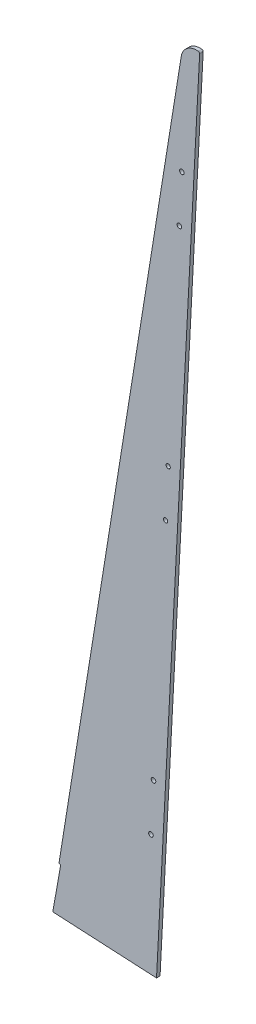
ISO-10303-21;
HEADER;
FILE_DESCRIPTION(('STEP AP214'),'2;1');
FILE_NAME('part.step','',(''),(''),'','','');
FILE_SCHEMA(('AUTOMOTIVE_DESIGN { 1 0 10303 214 1 1 1 1 }'));
ENDSEC;
DATA;
#1=APPLICATION_CONTEXT('core data for automotive mechanical design processes');
#2=APPLICATION_PROTOCOL_DEFINITION('international standard','automotive_design',2000,#1);
#3=PRODUCT_CONTEXT('',#1,'mechanical');
#4=PRODUCT('Part','Part','',(#3));
#5=PRODUCT_RELATED_PRODUCT_CATEGORY('part','',(#4));
#6=PRODUCT_DEFINITION_FORMATION('','',#4);
#7=PRODUCT_DEFINITION_CONTEXT('part definition',#1,'design');
#8=PRODUCT_DEFINITION('design','',#6,#7);
#9=PRODUCT_DEFINITION_SHAPE('','',#8);
#10=(LENGTH_UNIT() NAMED_UNIT(*) SI_UNIT(.MILLI.,.METRE.));
#11=(NAMED_UNIT(*) PLANE_ANGLE_UNIT() SI_UNIT($,.RADIAN.));
#12=(NAMED_UNIT(*) SI_UNIT($,.STERADIAN.) SOLID_ANGLE_UNIT());
#13=UNCERTAINTY_MEASURE_WITH_UNIT(LENGTH_MEASURE(1.E-05),#10,'distance_accuracy_value','');
#14=(GEOMETRIC_REPRESENTATION_CONTEXT(3) GLOBAL_UNCERTAINTY_ASSIGNED_CONTEXT((#13)) GLOBAL_UNIT_ASSIGNED_CONTEXT((#10,
#11,#12)) REPRESENTATION_CONTEXT('',''));
#15=CARTESIAN_POINT('',(0.,0.,0.));
#16=DIRECTION('',(0.,0.,1.));
#17=DIRECTION('',(1.,0.,0.));
#18=AXIS2_PLACEMENT_3D('',#15,#16,#17);
#19=CARTESIAN_POINT('',(206.998865773885,1162.43136317861,5.));
#20=DIRECTION('',(0.,0.,-1.));
#21=DIRECTION('',(-1.,0.,0.));
#22=AXIS2_PLACEMENT_3D('',#19,#20,#21);
#23=CYLINDRICAL_SURFACE('',#22,2.);
#24=CARTESIAN_POINT('',(206.998865773885,1162.43136317861,0.));
#25=DIRECTION('',(0.,0.,1.));
#26=DIRECTION('',(1.,0.,0.));
#27=AXIS2_PLACEMENT_3D('',#24,#25,#26);
#28=CIRCLE('',#27,2.);
#29=CARTESIAN_POINT('',(207.225341391164,1164.41849900556,0.));
#30=VERTEX_POINT('',#29);
#31=CARTESIAN_POINT('',(208.996117549459,1162.3265521822,0.));
#32=VERTEX_POINT('',#31);
#33=EDGE_CURVE('E121',#30,#32,#28,.F.);
#34=ORIENTED_EDGE('',*,*,#33,.F.);
#35=DIRECTION('',(0.,0.,1.));
#36=VECTOR('',#35,1.);
#37=CARTESIAN_POINT('',(207.225341391164,1164.41849900556,-82.8604517494849));
#38=LINE('',#37,#36);
#39=CARTESIAN_POINT('',(207.225341391164,1164.41849900556,5.));
#40=VERTEX_POINT('',#39);
#41=EDGE_CURVE('E130',#30,#40,#38,.T.);
#42=ORIENTED_EDGE('',*,*,#41,.T.);
#43=CARTESIAN_POINT('',(206.998865773885,1162.43136317861,5.));
#44=DIRECTION('',(0.,0.,1.));
#45=DIRECTION('',(1.,0.,0.));
#46=AXIS2_PLACEMENT_3D('',#43,#44,#45);
#47=CIRCLE('',#46,2.);
#48=CARTESIAN_POINT('',(208.996117549459,1162.3265521822,5.));
#49=VERTEX_POINT('',#48);
#50=EDGE_CURVE('E11',#49,#40,#47,.T.);
#51=ORIENTED_EDGE('',*,*,#50,.F.);
#52=DIRECTION('',(0.,0.,-1.));
#53=VECTOR('',#52,1.);
#54=CARTESIAN_POINT('',(208.996117549459,1162.3265521822,5.));
#55=LINE('',#54,#53);
#56=EDGE_CURVE('E40',#32,#49,#55,.F.);
#57=ORIENTED_EDGE('',*,*,#56,.F.);
#58=EDGE_LOOP('',(#34,#42,#51,#57));
#59=FACE_BOUND('',#58,.T.);
#60=ADVANCED_FACE('F33',(#59),#23,.T.);
#61=CARTESIAN_POINT('',(210.710741946621,1195.,5.));
#62=DIRECTION('',(0.984807753012207,-0.173648177666934,0.));
#63=DIRECTION('',(0.173648177666934,0.984807753012207,0.));
#64=AXIS2_PLACEMENT_3D('',#61,#62,#63);
#65=PLANE('',#64);
#66=DIRECTION('',(-0.173648177666934,-0.984807753012207,0.));
#67=VECTOR('',#66,1.);
#68=CARTESIAN_POINT('',(210.710741946621,1195.,0.));
#69=LINE('',#68,#67);
#70=CARTESIAN_POINT('',(12.780385858583,72.4811699674794,0.));
#71=VERTEX_POINT('',#70);
#72=CARTESIAN_POINT('',(1.65871056210588,9.40701505487874,0.));
#73=VERTEX_POINT('',#72);
#74=EDGE_CURVE('E96',#71,#73,#69,.T.);
#75=ORIENTED_EDGE('',*,*,#74,.T.);
#76=DIRECTION('',(0.,0.,1.));
#77=VECTOR('',#76,1.);
#78=CARTESIAN_POINT('',(1.65871056210588,9.40701505487874,0.));
#79=LINE('',#78,#77);
#80=CARTESIAN_POINT('',(1.65871056210588,9.40701505487874,5.));
#81=VERTEX_POINT('',#80);
#82=EDGE_CURVE('E105',#73,#81,#79,.T.);
#83=ORIENTED_EDGE('',*,*,#82,.T.);
#84=DIRECTION('',(-0.173648177666934,-0.984807753012207,0.));
#85=VECTOR('',#84,1.);
#86=CARTESIAN_POINT('',(210.710741946621,1195.,5.));
#87=LINE('',#86,#85);
#88=CARTESIAN_POINT('',(12.780385858583,72.4811699674795,5.));
#89=VERTEX_POINT('',#88);
#90=EDGE_CURVE('E47',#89,#81,#87,.T.);
#91=ORIENTED_EDGE('',*,*,#90,.F.);
#92=DIRECTION('',(0.,0.,1.));
#93=VECTOR('',#92,1.);
#94=CARTESIAN_POINT('',(12.780385858583,72.4811699674794,-1035.2597649131));
#95=LINE('',#94,#93);
#96=EDGE_CURVE('E111',#71,#89,#95,.T.);
#97=ORIENTED_EDGE('',*,*,#96,.F.);
#98=EDGE_LOOP('',(#75,#83,#91,#97));
#99=FACE_BOUND('',#98,.T.);
#100=ADVANCED_FACE('F110',(#99),#65,.F.);
#101=CARTESIAN_POINT('',(148.,0.,5.));
#102=DIRECTION('',(-0.998625887786964,0.0524054982010237,0.));
#103=DIRECTION('',(-0.0524054982010237,-0.998625887786964,0.));
#104=AXIS2_PLACEMENT_3D('',#101,#102,#103);
#105=PLANE('',#104);
#106=DIRECTION('',(0.0524054982010237,0.998625887786964,0.));
#107=VECTOR('',#106,1.);
#108=CARTESIAN_POINT('',(148.,0.,5.));
#109=LINE('',#108,#107);
#110=CARTESIAN_POINT('',(148.090399514804,1.72263023586594,5.));
#111=VERTEX_POINT('',#110);
#112=EDGE_CURVE('E54',#111,#49,#109,.T.);
#113=ORIENTED_EDGE('',*,*,#112,.F.);
#114=DIRECTION('',(0.,0.,1.));
#115=VECTOR('',#114,1.);
#116=CARTESIAN_POINT('',(148.090399514804,1.72263023586594,-95.2383540546846));
#117=LINE('',#116,#115);
#118=CARTESIAN_POINT('',(148.090399514804,1.72263023586594,0.));
#119=VERTEX_POINT('',#118);
#120=EDGE_CURVE('E103',#119,#111,#117,.T.);
#121=ORIENTED_EDGE('',*,*,#120,.F.);
#122=DIRECTION('',(0.0524054982010237,0.998625887786964,0.));
#123=VECTOR('',#122,1.);
#124=CARTESIAN_POINT('',(148.,0.,0.));
#125=LINE('',#124,#123);
#126=EDGE_CURVE('E98',#119,#32,#125,.T.);
#127=ORIENTED_EDGE('',*,*,#126,.T.);
#128=ORIENTED_EDGE('',*,*,#56,.T.);
#129=EDGE_LOOP('',(#113,#121,#127,#128));
#130=FACE_BOUND('',#129,.T.);
#131=ADVANCED_FACE('F125',(#130),#105,.F.);
#132=CARTESIAN_POINT('',(0.,0.,5.));
#133=DIRECTION('',(0.,0.,1.));
#134=DIRECTION('',(1.,0.,0.));
#135=AXIS2_PLACEMENT_3D('',#132,#133,#134);
#136=PLANE('',#135);
#137=CARTESIAN_POINT('',(160.968231328567,567.825650117369,5.));
#138=DIRECTION('',(0.,0.,1.));
#139=DIRECTION('',(1.,0.,0.));
#140=AXIS2_PLACEMENT_3D('',#137,#138,#139);
#141=CIRCLE('',#140,2.99999999999999);
#142=CARTESIAN_POINT('',(163.968231328567,567.825650117369,5.));
#143=VERTEX_POINT('',#142);
#144=EDGE_CURVE('E332',#143,#143,#141,.T.);
#145=ORIENTED_EDGE('',*,*,#144,.F.);
#146=EDGE_LOOP('',(#145));
#147=FACE_BOUND('',#146,.T.);
#148=CARTESIAN_POINT('',(164.531805206237,635.732210486883,5.));
#149=DIRECTION('',(0.,0.,1.));
#150=DIRECTION('',(1.,0.,0.));
#151=AXIS2_PLACEMENT_3D('',#148,#149,#150);
#152=CIRCLE('',#151,2.99999999999999);
#153=CARTESIAN_POINT('',(167.531805206237,635.732210486883,5.));
#154=VERTEX_POINT('',#153);
#155=EDGE_CURVE('E337',#154,#154,#152,.T.);
#156=ORIENTED_EDGE('',*,*,#155,.F.);
#157=EDGE_LOOP('',(#156));
#158=FACE_BOUND('',#157,.T.);
#159=ORIENTED_EDGE('',*,*,#90,.T.);
#160=DIRECTION('',(0.998625887786964,-0.0524054982010227,0.));
#161=VECTOR('',#160,1.);
#162=CARTESIAN_POINT('',(148.090399514804,1.72263023586594,5.));
#163=LINE('',#162,#161);
#164=EDGE_CURVE('E107',#81,#111,#163,.T.);
#165=ORIENTED_EDGE('',*,*,#164,.T.);
#166=ORIENTED_EDGE('',*,*,#112,.T.);
#167=ORIENTED_EDGE('',*,*,#50,.T.);
#168=CARTESIAN_POINT('',(204.728163817834,1142.50783558912,5.));
#169=DIRECTION('',(0.,0.,1.));
#170=DIRECTION('',(-1.,0.,0.));
#171=AXIS2_PLACEMENT_3D('',#168,#169,#170);
#172=CIRCLE('',#171,22.0525070497948);
#173=CARTESIAN_POINT('',(182.955612004679,1146.01055663493,5.));
#174=VERTEX_POINT('',#173);
#175=EDGE_CURVE('E135',#40,#174,#172,.T.);
#176=ORIENTED_EDGE('',*,*,#175,.T.);
#177=DIRECTION('',(-0.158835502824888,-0.987305060780286,0.));
#178=VECTOR('',#177,1.);
#179=CARTESIAN_POINT('',(174.215761350537,1091.68454873472,5.));
#180=LINE('',#179,#178);
#181=CARTESIAN_POINT('',(10.3183664760525,72.9152904116467,5.));
#182=VERTEX_POINT('',#181);
#183=EDGE_CURVE('E137',#174,#182,#180,.T.);
#184=ORIENTED_EDGE('',*,*,#183,.T.);
#185=DIRECTION('',(0.984807753012207,-0.173648177666935,0.));
#186=VECTOR('',#185,1.);
#187=CARTESIAN_POINT('',(10.3183664760525,72.9152904116467,5.));
#188=LINE('',#187,#186);
#189=EDGE_CURVE('E155',#182,#89,#188,.T.);
#190=ORIENTED_EDGE('',*,*,#189,.T.);
#191=EDGE_LOOP('',(#159,#165,#166,#167,#176,#184,#190));
#192=FACE_BOUND('',#191,.T.);
#193=CARTESIAN_POINT('',(183.932173312111,1005.42070669728,5.));
#194=DIRECTION('',(0.,0.,1.));
#195=DIRECTION('',(1.,0.,0.));
#196=AXIS2_PLACEMENT_3D('',#193,#194,#195);
#197=CIRCLE('',#196,3.25000000000002);
#198=CARTESIAN_POINT('',(187.182173312111,1005.42070669728,5.));
#199=VERTEX_POINT('',#198);
#200=EDGE_CURVE('E353',#199,#199,#197,.T.);
#201=ORIENTED_EDGE('',*,*,#200,.F.);
#202=EDGE_LOOP('',(#201));
#203=FACE_BOUND('',#202,.T.);
#204=CARTESIAN_POINT('',(140.269196381058,173.39008781232,5.));
#205=DIRECTION('',(0.,0.,1.));
#206=DIRECTION('',(1.,0.,0.));
#207=AXIS2_PLACEMENT_3D('',#204,#205,#206);
#208=CIRCLE('',#207,3.25000000000001);
#209=CARTESIAN_POINT('',(143.519196381058,173.39008781232,5.));
#210=VERTEX_POINT('',#209);
#211=EDGE_CURVE('E347',#210,#210,#208,.T.);
#212=ORIENTED_EDGE('',*,*,#211,.F.);
#213=EDGE_LOOP('',(#212));
#214=FACE_BOUND('',#213,.T.);
#215=CARTESIAN_POINT('',(143.832770258727,241.296648181834,5.));
#216=DIRECTION('',(0.,0.,1.));
#217=DIRECTION('',(1.,0.,0.));
#218=AXIS2_PLACEMENT_3D('',#215,#216,#217);
#219=CIRCLE('',#218,3.25000000000001);
#220=CARTESIAN_POINT('',(147.082770258727,241.296648181834,5.));
#221=VERTEX_POINT('',#220);
#222=EDGE_CURVE('E102',#221,#221,#219,.T.);
#223=ORIENTED_EDGE('',*,*,#222,.F.);
#224=EDGE_LOOP('',(#223));
#225=FACE_BOUND('',#224,.T.);
#226=CARTESIAN_POINT('',(180.368599434441,937.51414632777,5.));
#227=DIRECTION('',(0.,0.,1.));
#228=DIRECTION('',(1.,0.,0.));
#229=AXIS2_PLACEMENT_3D('',#226,#227,#228);
#230=CIRCLE('',#229,3.24999999999999);
#231=CARTESIAN_POINT('',(183.618599434441,937.51414632777,5.));
#232=VERTEX_POINT('',#231);
#233=EDGE_CURVE('E146',#232,#232,#230,.T.);
#234=ORIENTED_EDGE('',*,*,#233,.F.);
#235=EDGE_LOOP('',(#234));
#236=FACE_BOUND('',#235,.T.);
#237=ADVANCED_FACE('F132',(#147,#158,#192,#203,#214,#225,#236),#136,.T.);
#238=CARTESIAN_POINT('',(0.,0.,0.));
#239=DIRECTION('',(0.,0.,1.));
#240=DIRECTION('',(1.,0.,0.));
#241=AXIS2_PLACEMENT_3D('',#238,#239,#240);
#242=PLANE('',#241);
#243=CARTESIAN_POINT('',(160.968231328567,567.825650117369,0.));
#244=DIRECTION('',(0.,0.,1.));
#245=DIRECTION('',(1.,0.,0.));
#246=AXIS2_PLACEMENT_3D('',#243,#244,#245);
#247=CIRCLE('',#246,2.99999999999999);
#248=CARTESIAN_POINT('',(163.968231328567,567.825650117369,0.));
#249=VERTEX_POINT('',#248);
#250=EDGE_CURVE('E108',#249,#249,#247,.T.);
#251=ORIENTED_EDGE('',*,*,#250,.T.);
#252=EDGE_LOOP('',(#251));
#253=FACE_BOUND('',#252,.T.);
#254=CARTESIAN_POINT('',(164.531805206237,635.732210486883,0.));
#255=DIRECTION('',(0.,0.,1.));
#256=DIRECTION('',(1.,0.,0.));
#257=AXIS2_PLACEMENT_3D('',#254,#255,#256);
#258=CIRCLE('',#257,2.99999999999999);
#259=CARTESIAN_POINT('',(167.531805206237,635.732210486883,0.));
#260=VERTEX_POINT('',#259);
#261=EDGE_CURVE('E333',#260,#260,#258,.T.);
#262=ORIENTED_EDGE('',*,*,#261,.T.);
#263=EDGE_LOOP('',(#262));
#264=FACE_BOUND('',#263,.T.);
#265=CARTESIAN_POINT('',(183.932173312111,1005.42070669728,0.));
#266=DIRECTION('',(0.,0.,1.));
#267=DIRECTION('',(1.,0.,0.));
#268=AXIS2_PLACEMENT_3D('',#265,#266,#267);
#269=CIRCLE('',#268,3.25000000000002);
#270=CARTESIAN_POINT('',(187.182173312111,1005.42070669728,0.));
#271=VERTEX_POINT('',#270);
#272=EDGE_CURVE('E350',#271,#271,#269,.T.);
#273=ORIENTED_EDGE('',*,*,#272,.T.);
#274=EDGE_LOOP('',(#273));
#275=FACE_BOUND('',#274,.T.);
#276=CARTESIAN_POINT('',(140.269196381058,173.39008781232,0.));
#277=DIRECTION('',(0.,0.,1.));
#278=DIRECTION('',(1.,0.,0.));
#279=AXIS2_PLACEMENT_3D('',#276,#277,#278);
#280=CIRCLE('',#279,3.25000000000001);
#281=CARTESIAN_POINT('',(143.519196381058,173.39008781232,0.));
#282=VERTEX_POINT('',#281);
#283=EDGE_CURVE('E356',#282,#282,#280,.T.);
#284=ORIENTED_EDGE('',*,*,#283,.T.);
#285=EDGE_LOOP('',(#284));
#286=FACE_BOUND('',#285,.T.);
#287=CARTESIAN_POINT('',(143.832770258727,241.296648181834,0.));
#288=DIRECTION('',(0.,0.,1.));
#289=DIRECTION('',(1.,0.,0.));
#290=AXIS2_PLACEMENT_3D('',#287,#288,#289);
#291=CIRCLE('',#290,3.25000000000001);
#292=CARTESIAN_POINT('',(147.082770258727,241.296648181834,0.));
#293=VERTEX_POINT('',#292);
#294=EDGE_CURVE('E344',#293,#293,#291,.T.);
#295=ORIENTED_EDGE('',*,*,#294,.T.);
#296=EDGE_LOOP('',(#295));
#297=FACE_BOUND('',#296,.T.);
#298=CARTESIAN_POINT('',(180.368599434441,937.51414632777,0.));
#299=DIRECTION('',(0.,0.,1.));
#300=DIRECTION('',(1.,0.,0.));
#301=AXIS2_PLACEMENT_3D('',#298,#299,#300);
#302=CIRCLE('',#301,3.24999999999999);
#303=CARTESIAN_POINT('',(183.618599434441,937.51414632777,0.));
#304=VERTEX_POINT('',#303);
#305=EDGE_CURVE('E141',#304,#304,#302,.T.);
#306=ORIENTED_EDGE('',*,*,#305,.T.);
#307=EDGE_LOOP('',(#306));
#308=FACE_BOUND('',#307,.T.);
#309=DIRECTION('',(-0.998625887786964,0.0524054982010227,0.));
#310=VECTOR('',#309,1.);
#311=CARTESIAN_POINT('',(148.090399514804,1.72263023586594,0.));
#312=LINE('',#311,#310);
#313=EDGE_CURVE('E92',#119,#73,#312,.T.);
#314=ORIENTED_EDGE('',*,*,#313,.T.);
#315=ORIENTED_EDGE('',*,*,#74,.F.);
#316=DIRECTION('',(-0.984807753012207,0.173648177666935,0.));
#317=VECTOR('',#316,1.);
#318=CARTESIAN_POINT('',(10.3183664760525,72.9152904116467,0.));
#319=LINE('',#318,#317);
#320=CARTESIAN_POINT('',(10.3183664760524,72.9152904116468,0.));
#321=VERTEX_POINT('',#320);
#322=EDGE_CURVE('E113',#71,#321,#319,.T.);
#323=ORIENTED_EDGE('',*,*,#322,.T.);
#324=DIRECTION('',(0.158835502824888,0.987305060780286,0.));
#325=VECTOR('',#324,1.);
#326=CARTESIAN_POINT('',(174.215761350537,1091.68454873472,0.));
#327=LINE('',#326,#325);
#328=CARTESIAN_POINT('',(182.955612004679,1146.01055663493,0.));
#329=VERTEX_POINT('',#328);
#330=EDGE_CURVE('E116',#321,#329,#327,.T.);
#331=ORIENTED_EDGE('',*,*,#330,.T.);
#332=CARTESIAN_POINT('',(204.728163817834,1142.50783558912,0.));
#333=DIRECTION('',(0.,0.,1.));
#334=DIRECTION('',(1.,0.,0.));
#335=AXIS2_PLACEMENT_3D('',#332,#333,#334);
#336=CIRCLE('',#335,22.0525070497948);
#337=EDGE_CURVE('E150',#329,#30,#336,.F.);
#338=ORIENTED_EDGE('',*,*,#337,.T.);
#339=ORIENTED_EDGE('',*,*,#33,.T.);
#340=ORIENTED_EDGE('',*,*,#126,.F.);
#341=EDGE_LOOP('',(#314,#315,#323,#331,#338,#339,#340));
#342=FACE_BOUND('',#341,.T.);
#343=ADVANCED_FACE('F94',(#253,#264,#275,#286,#297,#308,#342),#242,.F.);
#344=CARTESIAN_POINT('',(10.3183664760525,72.9152904116467,-1035.2597649131));
#345=DIRECTION('',(-0.173648177666935,-0.984807753012207,0.));
#346=DIRECTION('',(0.984807753012207,-0.173648177666935,0.));
#347=AXIS2_PLACEMENT_3D('',#344,#345,#346);
#348=PLANE('',#347);
#349=ORIENTED_EDGE('',*,*,#322,.F.);
#350=ORIENTED_EDGE('',*,*,#96,.T.);
#351=ORIENTED_EDGE('',*,*,#189,.F.);
#352=DIRECTION('',(0.,0.,1.));
#353=VECTOR('',#352,1.);
#354=CARTESIAN_POINT('',(10.3183664760525,72.9152904116467,-1035.2597649131));
#355=LINE('',#354,#353);
#356=EDGE_CURVE('E157',#321,#182,#355,.T.);
#357=ORIENTED_EDGE('',*,*,#356,.F.);
#358=EDGE_LOOP('',(#349,#350,#351,#357));
#359=FACE_BOUND('',#358,.T.);
#360=ADVANCED_FACE('F161',(#359),#348,.T.);
#361=CARTESIAN_POINT('',(174.215761350537,1091.68454873472,-1035.2597649131));
#362=DIRECTION('',(-0.987305060780286,0.158835502824888,0.));
#363=DIRECTION('',(-0.158835502824888,-0.987305060780286,0.));
#364=AXIS2_PLACEMENT_3D('',#361,#362,#363);
#365=PLANE('',#364);
#366=ORIENTED_EDGE('',*,*,#330,.F.);
#367=ORIENTED_EDGE('',*,*,#356,.T.);
#368=ORIENTED_EDGE('',*,*,#183,.F.);
#369=DIRECTION('',(0.,0.,1.));
#370=VECTOR('',#369,1.);
#371=CARTESIAN_POINT('',(182.955612004679,1146.01055663493,-82.8604517494849));
#372=LINE('',#371,#370);
#373=EDGE_CURVE('E143',#329,#174,#372,.T.);
#374=ORIENTED_EDGE('',*,*,#373,.F.);
#375=EDGE_LOOP('',(#366,#367,#368,#374));
#376=FACE_BOUND('',#375,.T.);
#377=ADVANCED_FACE('F166',(#376),#365,.T.);
#378=CARTESIAN_POINT('',(204.728163817834,1142.50783558912,-82.8604517494849));
#379=DIRECTION('',(0.,0.,1.));
#380=DIRECTION('',(1.,0.,0.));
#381=AXIS2_PLACEMENT_3D('',#378,#379,#380);
#382=CYLINDRICAL_SURFACE('',#381,22.0525070497948);
#383=ORIENTED_EDGE('',*,*,#337,.F.);
#384=ORIENTED_EDGE('',*,*,#373,.T.);
#385=ORIENTED_EDGE('',*,*,#175,.F.);
#386=ORIENTED_EDGE('',*,*,#41,.F.);
#387=EDGE_LOOP('',(#383,#384,#385,#386));
#388=FACE_BOUND('',#387,.T.);
#389=ADVANCED_FACE('F167',(#388),#382,.T.);
#390=CARTESIAN_POINT('',(180.368599434441,937.51414632777,0.));
#391=DIRECTION('',(0.,0.,1.));
#392=DIRECTION('',(1.,0.,0.));
#393=AXIS2_PLACEMENT_3D('',#390,#391,#392);
#394=CYLINDRICAL_SURFACE('',#393,3.24999999999999);
#395=ORIENTED_EDGE('',*,*,#305,.F.);
#396=EDGE_LOOP('',(#395));
#397=FACE_BOUND('',#396,.T.);
#398=ORIENTED_EDGE('',*,*,#233,.T.);
#399=EDGE_LOOP('',(#398));
#400=FACE_BOUND('',#399,.T.);
#401=ADVANCED_FACE('F169',(#397,#400),#394,.F.);
#402=CARTESIAN_POINT('',(143.832770258727,241.296648181834,0.));
#403=DIRECTION('',(0.,0.,1.));
#404=DIRECTION('',(1.,0.,0.));
#405=AXIS2_PLACEMENT_3D('',#402,#403,#404);
#406=CYLINDRICAL_SURFACE('',#405,3.25000000000001);
#407=ORIENTED_EDGE('',*,*,#294,.F.);
#408=EDGE_LOOP('',(#407));
#409=FACE_BOUND('',#408,.T.);
#410=ORIENTED_EDGE('',*,*,#222,.T.);
#411=EDGE_LOOP('',(#410));
#412=FACE_BOUND('',#411,.T.);
#413=ADVANCED_FACE('F175',(#409,#412),#406,.F.);
#414=CARTESIAN_POINT('',(140.269196381058,173.39008781232,0.));
#415=DIRECTION('',(0.,0.,1.));
#416=DIRECTION('',(1.,0.,0.));
#417=AXIS2_PLACEMENT_3D('',#414,#415,#416);
#418=CYLINDRICAL_SURFACE('',#417,3.25000000000001);
#419=ORIENTED_EDGE('',*,*,#283,.F.);
#420=EDGE_LOOP('',(#419));
#421=FACE_BOUND('',#420,.T.);
#422=ORIENTED_EDGE('',*,*,#211,.T.);
#423=EDGE_LOOP('',(#422));
#424=FACE_BOUND('',#423,.T.);
#425=ADVANCED_FACE('F231',(#421,#424),#418,.F.);
#426=CARTESIAN_POINT('',(183.932173312111,1005.42070669728,0.));
#427=DIRECTION('',(0.,0.,1.));
#428=DIRECTION('',(1.,0.,0.));
#429=AXIS2_PLACEMENT_3D('',#426,#427,#428);
#430=CYLINDRICAL_SURFACE('',#429,3.25000000000002);
#431=ORIENTED_EDGE('',*,*,#272,.F.);
#432=EDGE_LOOP('',(#431));
#433=FACE_BOUND('',#432,.T.);
#434=ORIENTED_EDGE('',*,*,#200,.T.);
#435=EDGE_LOOP('',(#434));
#436=FACE_BOUND('',#435,.T.);
#437=ADVANCED_FACE('F241',(#433,#436),#430,.F.);
#438=CARTESIAN_POINT('',(148.090399514804,1.72263023586594,-95.2383540546846));
#439=DIRECTION('',(-0.0524054982010227,-0.998625887786964,0.));
#440=DIRECTION('',(0.998625887786964,-0.0524054982010227,0.));
#441=AXIS2_PLACEMENT_3D('',#438,#439,#440);
#442=PLANE('',#441);
#443=ORIENTED_EDGE('',*,*,#313,.F.);
#444=ORIENTED_EDGE('',*,*,#120,.T.);
#445=ORIENTED_EDGE('',*,*,#164,.F.);
#446=ORIENTED_EDGE('',*,*,#82,.F.);
#447=EDGE_LOOP('',(#443,#444,#445,#446));
#448=FACE_BOUND('',#447,.T.);
#449=ADVANCED_FACE('F106',(#448),#442,.T.);
#450=CARTESIAN_POINT('',(164.531805206237,635.732210486883,0.));
#451=DIRECTION('',(0.,0.,1.));
#452=DIRECTION('',(1.,0.,0.));
#453=AXIS2_PLACEMENT_3D('',#450,#451,#452);
#454=CYLINDRICAL_SURFACE('',#453,2.99999999999999);
#455=ORIENTED_EDGE('',*,*,#261,.F.);
#456=EDGE_LOOP('',(#455));
#457=FACE_BOUND('',#456,.T.);
#458=ORIENTED_EDGE('',*,*,#155,.T.);
#459=EDGE_LOOP('',(#458));
#460=FACE_BOUND('',#459,.T.);
#461=ADVANCED_FACE('F273',(#457,#460),#454,.F.);
#462=CARTESIAN_POINT('',(160.968231328567,567.825650117369,0.));
#463=DIRECTION('',(0.,0.,1.));
#464=DIRECTION('',(1.,0.,0.));
#465=AXIS2_PLACEMENT_3D('',#462,#463,#464);
#466=CYLINDRICAL_SURFACE('',#465,2.99999999999999);
#467=ORIENTED_EDGE('',*,*,#250,.F.);
#468=EDGE_LOOP('',(#467));
#469=FACE_BOUND('',#468,.T.);
#470=ORIENTED_EDGE('',*,*,#144,.T.);
#471=EDGE_LOOP('',(#470));
#472=FACE_BOUND('',#471,.T.);
#473=ADVANCED_FACE('F279',(#469,#472),#466,.F.);
#474=CLOSED_SHELL('',(#60,#100,#131,#237,#343,#360,#377,#389,#401,#413,#425,#437,#449,#461,#473));
#475=MANIFOLD_SOLID_BREP('B2',#474);
#476=ADVANCED_BREP_SHAPE_REPRESENTATION('',(#18,#475),#14);
#477=SHAPE_DEFINITION_REPRESENTATION(#9,#476);
ENDSEC;
END-ISO-10303-21;
